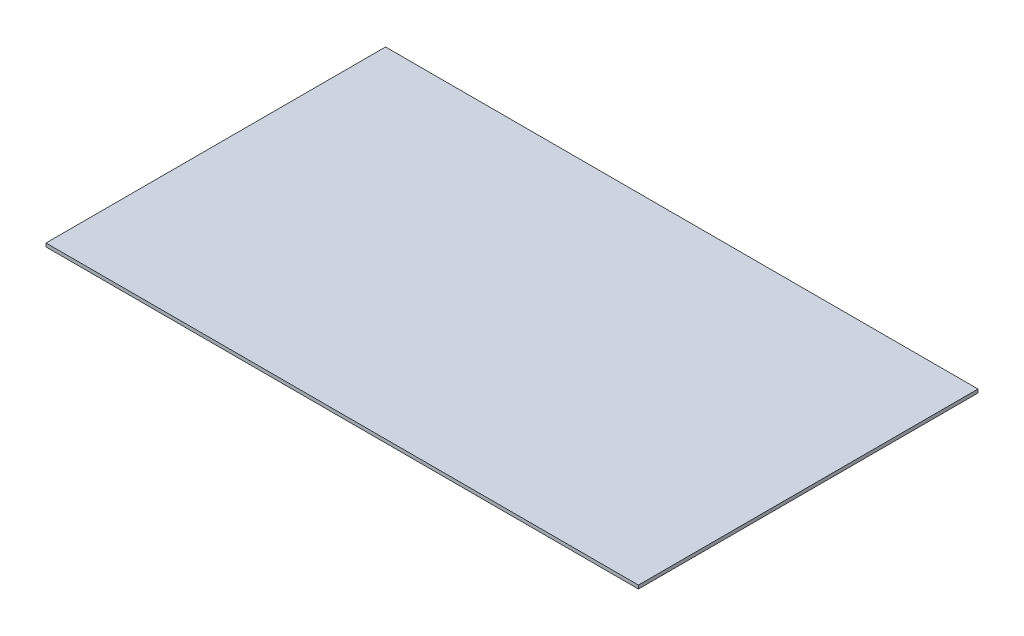
ISO-10303-21;
HEADER;
FILE_DESCRIPTION(('STEP AP214'),'2;1');
FILE_NAME('part.step','',(''),(''),'','','');
FILE_SCHEMA(('AUTOMOTIVE_DESIGN { 1 0 10303 214 1 1 1 1 }'));
ENDSEC;
DATA;
#1=APPLICATION_CONTEXT('core data for automotive mechanical design processes');
#2=APPLICATION_PROTOCOL_DEFINITION('international standard','automotive_design',2000,#1);
#3=PRODUCT_CONTEXT('',#1,'mechanical');
#4=PRODUCT('Part','Part','',(#3));
#5=PRODUCT_RELATED_PRODUCT_CATEGORY('part','',(#4));
#6=PRODUCT_DEFINITION_FORMATION('','',#4);
#7=PRODUCT_DEFINITION_CONTEXT('part definition',#1,'design');
#8=PRODUCT_DEFINITION('design','',#6,#7);
#9=PRODUCT_DEFINITION_SHAPE('','',#8);
#10=(LENGTH_UNIT() NAMED_UNIT(*) SI_UNIT(.MILLI.,.METRE.));
#11=(NAMED_UNIT(*) PLANE_ANGLE_UNIT() SI_UNIT($,.RADIAN.));
#12=(NAMED_UNIT(*) SI_UNIT($,.STERADIAN.) SOLID_ANGLE_UNIT());
#13=UNCERTAINTY_MEASURE_WITH_UNIT(LENGTH_MEASURE(1.E-05),#10,'distance_accuracy_value','');
#14=(GEOMETRIC_REPRESENTATION_CONTEXT(3) GLOBAL_UNCERTAINTY_ASSIGNED_CONTEXT((#13)) GLOBAL_UNIT_ASSIGNED_CONTEXT((#10,
#11,#12)) REPRESENTATION_CONTEXT('',''));
#15=CARTESIAN_POINT('',(0.,0.,0.));
#16=DIRECTION('',(0.,0.,1.));
#17=DIRECTION('',(1.,0.,0.));
#18=AXIS2_PLACEMENT_3D('',#15,#16,#17);
#19=CARTESIAN_POINT('',(-58.6602980523397,6.35,616.704291562994));
#20=DIRECTION('',(1.,0.,0.));
#21=DIRECTION('',(0.,0.,-1.));
#22=AXIS2_PLACEMENT_3D('',#19,#20,#21);
#23=PLANE('',#22);
#24=DIRECTION('',(0.,0.,1.));
#25=VECTOR('',#24,1.);
#26=CARTESIAN_POINT('',(-58.6602980523397,0.,616.704291562994));
#27=LINE('',#26,#25);
#28=CARTESIAN_POINT('',(-58.6602980523397,0.,616.704291562994));
#29=VERTEX_POINT('',#28);
#30=CARTESIAN_POINT('',(-58.6602980523397,0.,1239.00429156299));
#31=VERTEX_POINT('',#30);
#32=EDGE_CURVE('E100',#29,#31,#27,.T.);
#33=ORIENTED_EDGE('',*,*,#32,.T.);
#34=DIRECTION('',(0.,-1.,0.));
#35=VECTOR('',#34,1.);
#36=CARTESIAN_POINT('',(-58.6602980523397,6.35,1239.00429156299));
#37=LINE('',#36,#35);
#38=CARTESIAN_POINT('',(-58.6602980523397,6.35,1239.00429156299));
#39=VERTEX_POINT('',#38);
#40=EDGE_CURVE('E11',#39,#31,#37,.T.);
#41=ORIENTED_EDGE('',*,*,#40,.F.);
#42=DIRECTION('',(0.,0.,1.));
#43=VECTOR('',#42,1.);
#44=CARTESIAN_POINT('',(-58.6602980523397,6.35,616.704291562994));
#45=LINE('',#44,#43);
#46=CARTESIAN_POINT('',(-58.6602980523397,6.35,616.704291562994));
#47=VERTEX_POINT('',#46);
#48=EDGE_CURVE('E86',#47,#39,#45,.T.);
#49=ORIENTED_EDGE('',*,*,#48,.F.);
#50=DIRECTION('',(0.,-1.,0.));
#51=VECTOR('',#50,1.);
#52=CARTESIAN_POINT('',(-58.6602980523397,6.35,616.704291562994));
#53=LINE('',#52,#51);
#54=EDGE_CURVE('E96',#47,#29,#53,.T.);
#55=ORIENTED_EDGE('',*,*,#54,.T.);
#56=EDGE_LOOP('',(#33,#41,#49,#55));
#57=FACE_BOUND('',#56,.T.);
#58=ADVANCED_FACE('F34',(#57),#23,.F.);
#59=CARTESIAN_POINT('',(-58.6602980523397,6.35,1239.00429156299));
#60=DIRECTION('',(0.,0.,-1.));
#61=DIRECTION('',(-1.,0.,0.));
#62=AXIS2_PLACEMENT_3D('',#59,#60,#61);
#63=PLANE('',#62);
#64=DIRECTION('',(1.,0.,0.));
#65=VECTOR('',#64,1.);
#66=CARTESIAN_POINT('',(-58.6602980523397,0.,1239.00429156299));
#67=LINE('',#66,#65);
#68=CARTESIAN_POINT('',(1027.18970194766,0.,1239.00429156299));
#69=VERTEX_POINT('',#68);
#70=EDGE_CURVE('E90',#31,#69,#67,.T.);
#71=ORIENTED_EDGE('',*,*,#70,.T.);
#72=DIRECTION('',(0.,-1.,0.));
#73=VECTOR('',#72,1.);
#74=CARTESIAN_POINT('',(1027.18970194766,6.35,1239.00429156299));
#75=LINE('',#74,#73);
#76=CARTESIAN_POINT('',(1027.18970194766,6.35,1239.00429156299));
#77=VERTEX_POINT('',#76);
#78=EDGE_CURVE('E43',#77,#69,#75,.T.);
#79=ORIENTED_EDGE('',*,*,#78,.F.);
#80=DIRECTION('',(1.,0.,0.));
#81=VECTOR('',#80,1.);
#82=CARTESIAN_POINT('',(-58.6602980523397,6.35,1239.00429156299));
#83=LINE('',#82,#81);
#84=EDGE_CURVE('E81',#39,#77,#83,.T.);
#85=ORIENTED_EDGE('',*,*,#84,.F.);
#86=ORIENTED_EDGE('',*,*,#40,.T.);
#87=EDGE_LOOP('',(#71,#79,#85,#86));
#88=FACE_BOUND('',#87,.T.);
#89=ADVANCED_FACE('F89',(#88),#63,.F.);
#90=CARTESIAN_POINT('',(1027.18970194766,6.35,616.704291562994));
#91=DIRECTION('',(-1.,0.,0.));
#92=DIRECTION('',(0.,0.,1.));
#93=AXIS2_PLACEMENT_3D('',#90,#91,#92);
#94=PLANE('',#93);
#95=DIRECTION('',(0.,0.,-1.));
#96=VECTOR('',#95,1.);
#97=CARTESIAN_POINT('',(1027.18970194766,0.,616.704291562994));
#98=LINE('',#97,#96);
#99=CARTESIAN_POINT('',(1027.18970194766,0.,616.704291562994));
#100=VERTEX_POINT('',#99);
#101=EDGE_CURVE('E68',#69,#100,#98,.T.);
#102=ORIENTED_EDGE('',*,*,#101,.T.);
#103=DIRECTION('',(0.,-1.,0.));
#104=VECTOR('',#103,1.);
#105=CARTESIAN_POINT('',(1027.18970194766,6.35,616.704291562994));
#106=LINE('',#105,#104);
#107=CARTESIAN_POINT('',(1027.18970194766,6.35,616.704291562994));
#108=VERTEX_POINT('',#107);
#109=EDGE_CURVE('E92',#108,#100,#106,.T.);
#110=ORIENTED_EDGE('',*,*,#109,.F.);
#111=DIRECTION('',(0.,0.,-1.));
#112=VECTOR('',#111,1.);
#113=CARTESIAN_POINT('',(1027.18970194766,6.35,616.704291562994));
#114=LINE('',#113,#112);
#115=EDGE_CURVE('E84',#77,#108,#114,.T.);
#116=ORIENTED_EDGE('',*,*,#115,.F.);
#117=ORIENTED_EDGE('',*,*,#78,.T.);
#118=EDGE_LOOP('',(#102,#110,#116,#117));
#119=FACE_BOUND('',#118,.T.);
#120=ADVANCED_FACE('F93',(#119),#94,.F.);
#121=CARTESIAN_POINT('',(-58.6602980523397,6.35,616.704291562994));
#122=DIRECTION('',(0.,0.,1.));
#123=DIRECTION('',(1.,0.,0.));
#124=AXIS2_PLACEMENT_3D('',#121,#122,#123);
#125=PLANE('',#124);
#126=DIRECTION('',(-1.,0.,0.));
#127=VECTOR('',#126,1.);
#128=CARTESIAN_POINT('',(-58.6602980523397,0.,616.704291562994));
#129=LINE('',#128,#127);
#130=EDGE_CURVE('E74',#100,#29,#129,.T.);
#131=ORIENTED_EDGE('',*,*,#130,.T.);
#132=ORIENTED_EDGE('',*,*,#54,.F.);
#133=DIRECTION('',(-1.,0.,0.));
#134=VECTOR('',#133,1.);
#135=CARTESIAN_POINT('',(-58.6602980523397,6.35,616.704291562994));
#136=LINE('',#135,#134);
#137=EDGE_CURVE('E51',#108,#47,#136,.T.);
#138=ORIENTED_EDGE('',*,*,#137,.F.);
#139=ORIENTED_EDGE('',*,*,#109,.T.);
#140=EDGE_LOOP('',(#131,#132,#138,#139));
#141=FACE_BOUND('',#140,.T.);
#142=ADVANCED_FACE('F107',(#141),#125,.F.);
#143=CARTESIAN_POINT('',(0.,6.35,0.));
#144=DIRECTION('',(0.,1.,0.));
#145=DIRECTION('',(0.,0.,1.));
#146=AXIS2_PLACEMENT_3D('',#143,#144,#145);
#147=PLANE('',#146);
#148=ORIENTED_EDGE('',*,*,#48,.T.);
#149=ORIENTED_EDGE('',*,*,#84,.T.);
#150=ORIENTED_EDGE('',*,*,#115,.T.);
#151=ORIENTED_EDGE('',*,*,#137,.T.);
#152=EDGE_LOOP('',(#148,#149,#150,#151));
#153=FACE_BOUND('',#152,.T.);
#154=ADVANCED_FACE('F82',(#153),#147,.T.);
#155=CARTESIAN_POINT('',(0.,0.,0.));
#156=DIRECTION('',(0.,1.,0.));
#157=DIRECTION('',(0.,0.,1.));
#158=AXIS2_PLACEMENT_3D('',#155,#156,#157);
#159=PLANE('',#158);
#160=ORIENTED_EDGE('',*,*,#32,.F.);
#161=ORIENTED_EDGE('',*,*,#130,.F.);
#162=ORIENTED_EDGE('',*,*,#101,.F.);
#163=ORIENTED_EDGE('',*,*,#70,.F.);
#164=EDGE_LOOP('',(#160,#161,#162,#163));
#165=FACE_BOUND('',#164,.T.);
#166=ADVANCED_FACE('F110',(#165),#159,.F.);
#167=CLOSED_SHELL('',(#58,#89,#120,#142,#154,#166));
#168=MANIFOLD_SOLID_BREP('B2',#167);
#169=ADVANCED_BREP_SHAPE_REPRESENTATION('',(#18,#168),#14);
#170=SHAPE_DEFINITION_REPRESENTATION(#9,#169);
ENDSEC;
END-ISO-10303-21;
